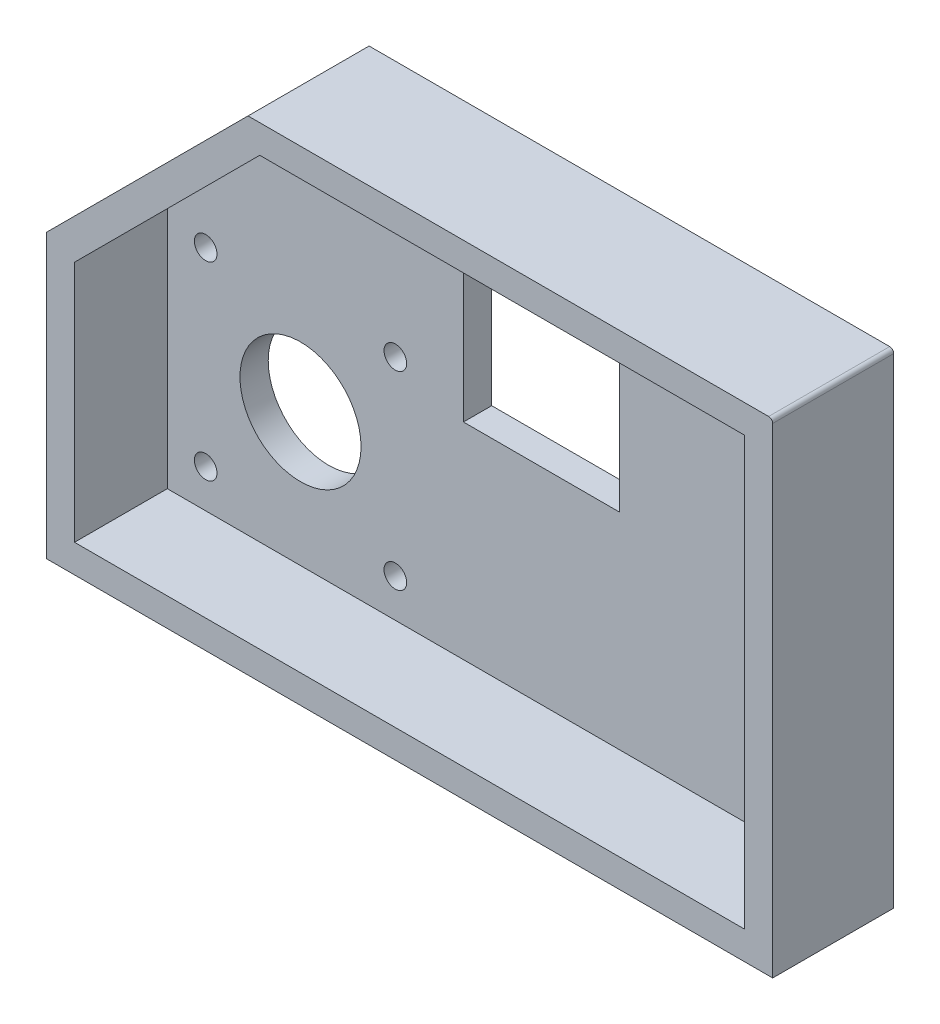
ISO-10303-21;
HEADER;
FILE_DESCRIPTION(('STEP AP214'),'2;1');
FILE_NAME('part.step','',(''),(''),'','','');
FILE_SCHEMA(('AUTOMOTIVE_DESIGN { 1 0 10303 214 1 1 1 1 }'));
ENDSEC;
DATA;
#1=APPLICATION_CONTEXT('core data for automotive mechanical design processes');
#2=APPLICATION_PROTOCOL_DEFINITION('international standard','automotive_design',2000,#1);
#3=PRODUCT_CONTEXT('',#1,'mechanical');
#4=PRODUCT('Part','Part','',(#3));
#5=PRODUCT_RELATED_PRODUCT_CATEGORY('part','',(#4));
#6=PRODUCT_DEFINITION_FORMATION('','',#4);
#7=PRODUCT_DEFINITION_CONTEXT('part definition',#1,'design');
#8=PRODUCT_DEFINITION('design','',#6,#7);
#9=PRODUCT_DEFINITION_SHAPE('','',#8);
#10=(LENGTH_UNIT() NAMED_UNIT(*) SI_UNIT(.MILLI.,.METRE.));
#11=(NAMED_UNIT(*) PLANE_ANGLE_UNIT() SI_UNIT($,.RADIAN.));
#12=(NAMED_UNIT(*) SI_UNIT($,.STERADIAN.) SOLID_ANGLE_UNIT());
#13=UNCERTAINTY_MEASURE_WITH_UNIT(LENGTH_MEASURE(1.E-05),#10,'distance_accuracy_value','');
#14=(GEOMETRIC_REPRESENTATION_CONTEXT(3) GLOBAL_UNCERTAINTY_ASSIGNED_CONTEXT((#13)) GLOBAL_UNIT_ASSIGNED_CONTEXT((#10,
#11,#12)) REPRESENTATION_CONTEXT('',''));
#15=CARTESIAN_POINT('',(0.,0.,0.));
#16=DIRECTION('',(0.,0.,1.));
#17=DIRECTION('',(1.,0.,0.));
#18=AXIS2_PLACEMENT_3D('',#15,#16,#17);
#19=CARTESIAN_POINT('',(-35.0799037167926,-32.7220936044638,-13.));
#20=DIRECTION('',(0.,0.,1.));
#21=DIRECTION('',(1.,0.,0.));
#22=AXIS2_PLACEMENT_3D('',#19,#20,#21);
#23=CYLINDRICAL_SURFACE('',#22,2.80599900368879);
#24=CARTESIAN_POINT('',(-35.0799037167926,-32.7220936044638,0.));
#25=DIRECTION('',(0.,0.,-1.));
#26=DIRECTION('',(-1.,0.,0.));
#27=AXIS2_PLACEMENT_3D('',#24,#25,#26);
#28=CIRCLE('',#27,2.80599900368879);
#29=CARTESIAN_POINT('',(-37.8859027204814,-32.7220936044638,0.));
#30=VERTEX_POINT('',#29);
#31=EDGE_CURVE('E47',#30,#30,#28,.T.);
#32=ORIENTED_EDGE('',*,*,#31,.T.);
#33=EDGE_LOOP('',(#32));
#34=FACE_BOUND('',#33,.T.);
#35=CARTESIAN_POINT('',(-35.0799037167926,-32.7220936044638,7.));
#36=DIRECTION('',(0.,0.,1.));
#37=DIRECTION('',(1.,0.,0.));
#38=AXIS2_PLACEMENT_3D('',#35,#36,#37);
#39=CIRCLE('',#38,2.80599900368879);
#40=CARTESIAN_POINT('',(-32.2739047131038,-32.7220936044638,7.));
#41=VERTEX_POINT('',#40);
#42=EDGE_CURVE('E11',#41,#41,#39,.T.);
#43=ORIENTED_EDGE('',*,*,#42,.T.);
#44=EDGE_LOOP('',(#43));
#45=FACE_BOUND('',#44,.T.);
#46=ADVANCED_FACE('F39',(#34,#45),#23,.F.);
#47=CARTESIAN_POINT('',(-82.0799037167926,-32.7220936044638,-13.));
#48=DIRECTION('',(0.,0.,1.));
#49=DIRECTION('',(1.,0.,0.));
#50=AXIS2_PLACEMENT_3D('',#47,#48,#49);
#51=CYLINDRICAL_SURFACE('',#50,2.80599900368879);
#52=CARTESIAN_POINT('',(-82.0799037167926,-32.7220936044638,0.));
#53=DIRECTION('',(0.,0.,-1.));
#54=DIRECTION('',(-1.,0.,0.));
#55=AXIS2_PLACEMENT_3D('',#52,#53,#54);
#56=CIRCLE('',#55,2.80599900368879);
#57=CARTESIAN_POINT('',(-84.8859027204814,-32.7220936044638,0.));
#58=VERTEX_POINT('',#57);
#59=EDGE_CURVE('E330',#58,#58,#56,.T.);
#60=ORIENTED_EDGE('',*,*,#59,.T.);
#61=EDGE_LOOP('',(#60));
#62=FACE_BOUND('',#61,.T.);
#63=CARTESIAN_POINT('',(-82.0799037167926,-32.7220936044638,7.));
#64=DIRECTION('',(0.,0.,1.));
#65=DIRECTION('',(1.,0.,0.));
#66=AXIS2_PLACEMENT_3D('',#63,#64,#65);
#67=CIRCLE('',#66,2.80599900368879);
#68=CARTESIAN_POINT('',(-79.2739047131038,-32.7220936044638,7.));
#69=VERTEX_POINT('',#68);
#70=EDGE_CURVE('E334',#69,#69,#67,.T.);
#71=ORIENTED_EDGE('',*,*,#70,.T.);
#72=EDGE_LOOP('',(#71));
#73=FACE_BOUND('',#72,.T.);
#74=ADVANCED_FACE('F363',(#62,#73),#51,.F.);
#75=CARTESIAN_POINT('',(80.4200962832074,69.7779063955362,30.));
#76=DIRECTION('',(0.,0.,-1.));
#77=DIRECTION('',(-1.,0.,0.));
#78=AXIS2_PLACEMENT_3D('',#75,#76,#77);
#79=PLANE('',#78);
#80=DIRECTION('',(0.,1.,0.));
#81=VECTOR('',#80,1.);
#82=CARTESIAN_POINT('',(81.4200962832074,69.7779063955362,30.));
#83=LINE('',#82,#81);
#84=CARTESIAN_POINT('',(81.4200962832074,-49.2220936044638,30.));
#85=VERTEX_POINT('',#84);
#86=CARTESIAN_POINT('',(81.4200962832074,69.7779063955362,30.));
#87=VERTEX_POINT('',#86);
#88=EDGE_CURVE('E269',#85,#87,#83,.T.);
#89=ORIENTED_EDGE('',*,*,#88,.T.);
#90=CARTESIAN_POINT('',(80.4200962832074,69.7779063955362,30.));
#91=DIRECTION('',(0.,0.,1.));
#92=DIRECTION('',(-1.,0.,0.));
#93=AXIS2_PLACEMENT_3D('',#90,#91,#92);
#94=CIRCLE('',#93,1.00000000000001);
#95=CARTESIAN_POINT('',(80.4200962832074,70.7779063955362,30.));
#96=VERTEX_POINT('',#95);
#97=EDGE_CURVE('E273',#87,#96,#94,.T.);
#98=ORIENTED_EDGE('',*,*,#97,.T.);
#99=DIRECTION('',(-1.,0.,0.));
#100=VECTOR('',#99,1.);
#101=CARTESIAN_POINT('',(-48.5799037167926,70.7779063955362,30.));
#102=LINE('',#101,#100);
#103=CARTESIAN_POINT('',(-48.5799037167926,70.7779063955362,30.));
#104=VERTEX_POINT('',#103);
#105=EDGE_CURVE('E277',#96,#104,#102,.T.);
#106=ORIENTED_EDGE('',*,*,#105,.T.);
#107=DIRECTION('',(-0.707106781186547,-0.707106781186547,0.));
#108=VECTOR('',#107,1.);
#109=CARTESIAN_POINT('',(-48.5799037167926,70.7779063955362,30.));
#110=LINE('',#109,#108);
#111=CARTESIAN_POINT('',(-98.5799037167926,20.7779063955362,30.));
#112=VERTEX_POINT('',#111);
#113=EDGE_CURVE('E280',#104,#112,#110,.T.);
#114=ORIENTED_EDGE('',*,*,#113,.T.);
#115=DIRECTION('',(0.,-1.,0.));
#116=VECTOR('',#115,1.);
#117=CARTESIAN_POINT('',(-98.5799037167926,20.7779063955362,30.));
#118=LINE('',#117,#116);
#119=CARTESIAN_POINT('',(-98.5799037167926,-49.2220936044638,30.));
#120=VERTEX_POINT('',#119);
#121=EDGE_CURVE('E283',#112,#120,#118,.T.);
#122=ORIENTED_EDGE('',*,*,#121,.T.);
#123=DIRECTION('',(1.,0.,0.));
#124=VECTOR('',#123,1.);
#125=CARTESIAN_POINT('',(-98.5799037167926,-49.2220936044638,30.));
#126=LINE('',#125,#124);
#127=EDGE_CURVE('E286',#120,#85,#126,.T.);
#128=ORIENTED_EDGE('',*,*,#127,.T.);
#129=EDGE_LOOP('',(#89,#98,#106,#114,#122,#128));
#130=FACE_BOUND('',#129,.T.);
#131=DIRECTION('',(0.,1.,0.));
#132=VECTOR('',#131,1.);
#133=CARTESIAN_POINT('',(74.4200962832074,69.7779063955362,30.));
#134=LINE('',#133,#132);
#135=CARTESIAN_POINT('',(74.4200962832074,-42.2220936044638,30.));
#136=VERTEX_POINT('',#135);
#137=CARTESIAN_POINT('',(74.4200962832074,63.7779063955362,30.));
#138=VERTEX_POINT('',#137);
#139=EDGE_CURVE('E254',#136,#138,#134,.T.);
#140=ORIENTED_EDGE('',*,*,#139,.F.);
#141=DIRECTION('',(1.,0.,0.));
#142=VECTOR('',#141,1.);
#143=CARTESIAN_POINT('',(80.4200962832074,-42.2220936044638,30.));
#144=LINE('',#143,#142);
#145=CARTESIAN_POINT('',(-91.5799037167926,-42.2220936044638,30.));
#146=VERTEX_POINT('',#145);
#147=EDGE_CURVE('E232',#146,#136,#144,.T.);
#148=ORIENTED_EDGE('',*,*,#147,.F.);
#149=DIRECTION('',(0.,-1.,0.));
#150=VECTOR('',#149,1.);
#151=CARTESIAN_POINT('',(-91.5799037167926,69.7779063955362,30.));
#152=LINE('',#151,#150);
#153=CARTESIAN_POINT('',(-91.5799037167926,17.8784114589246,30.));
#154=VERTEX_POINT('',#153);
#155=EDGE_CURVE('E263',#154,#146,#152,.T.);
#156=ORIENTED_EDGE('',*,*,#155,.F.);
#157=DIRECTION('',(-0.707106781186548,-0.707106781186548,0.));
#158=VECTOR('',#157,1.);
#159=CARTESIAN_POINT('',(20.3698437515132,129.82815892723,30.));
#160=LINE('',#159,#158);
#161=CARTESIAN_POINT('',(-45.680408780181,63.7779063955362,30.));
#162=VERTEX_POINT('',#161);
#163=EDGE_CURVE('E260',#162,#154,#160,.T.);
#164=ORIENTED_EDGE('',*,*,#163,.F.);
#165=DIRECTION('',(-1.,0.,0.));
#166=VECTOR('',#165,1.);
#167=CARTESIAN_POINT('',(80.4200962832074,63.7779063955362,30.));
#168=LINE('',#167,#166);
#169=EDGE_CURVE('E257',#138,#162,#168,.T.);
#170=ORIENTED_EDGE('',*,*,#169,.F.);
#171=EDGE_LOOP('',(#140,#148,#156,#164,#170));
#172=FACE_BOUND('',#171,.T.);
#173=ADVANCED_FACE('F367',(#130,#172),#79,.F.);
#174=CARTESIAN_POINT('',(81.4200962832074,69.7779063955362,30.));
#175=DIRECTION('',(-1.,0.,0.));
#176=DIRECTION('',(0.,-1.,0.));
#177=AXIS2_PLACEMENT_3D('',#174,#175,#176);
#178=PLANE('',#177);
#179=DIRECTION('',(0.,1.,0.));
#180=VECTOR('',#179,1.);
#181=CARTESIAN_POINT('',(81.4200962832074,69.7779063955362,0.));
#182=LINE('',#181,#180);
#183=CARTESIAN_POINT('',(81.4200962832074,-49.2220936044638,0.));
#184=VERTEX_POINT('',#183);
#185=CARTESIAN_POINT('',(81.4200962832074,69.7779063955362,0.));
#186=VERTEX_POINT('',#185);
#187=EDGE_CURVE('E225',#184,#186,#182,.T.);
#188=ORIENTED_EDGE('',*,*,#187,.T.);
#189=DIRECTION('',(0.,0.,-1.));
#190=VECTOR('',#189,1.);
#191=CARTESIAN_POINT('',(81.4200962832074,69.7779063955362,30.));
#192=LINE('',#191,#190);
#193=EDGE_CURVE('E326',#87,#186,#192,.T.);
#194=ORIENTED_EDGE('',*,*,#193,.F.);
#195=ORIENTED_EDGE('',*,*,#88,.F.);
#196=DIRECTION('',(0.,0.,-1.));
#197=VECTOR('',#196,1.);
#198=CARTESIAN_POINT('',(81.4200962832074,-49.2220936044638,30.));
#199=LINE('',#198,#197);
#200=EDGE_CURVE('E289',#85,#184,#199,.T.);
#201=ORIENTED_EDGE('',*,*,#200,.T.);
#202=EDGE_LOOP('',(#188,#194,#195,#201));
#203=FACE_BOUND('',#202,.T.);
#204=ADVANCED_FACE('F372',(#203),#178,.F.);
#205=CARTESIAN_POINT('',(80.4200962832074,69.7779063955362,30.));
#206=DIRECTION('',(0.,0.,-1.));
#207=DIRECTION('',(-1.,0.,0.));
#208=AXIS2_PLACEMENT_3D('',#205,#206,#207);
#209=CYLINDRICAL_SURFACE('',#208,1.00000000000001);
#210=CARTESIAN_POINT('',(80.4200962832074,69.7779063955362,0.));
#211=DIRECTION('',(0.,0.,1.));
#212=DIRECTION('',(-1.,0.,0.));
#213=AXIS2_PLACEMENT_3D('',#210,#211,#212);
#214=CIRCLE('',#213,1.00000000000001);
#215=CARTESIAN_POINT('',(80.4200962832074,70.7779063955362,0.));
#216=VERTEX_POINT('',#215);
#217=EDGE_CURVE('E293',#186,#216,#214,.T.);
#218=ORIENTED_EDGE('',*,*,#217,.T.);
#219=DIRECTION('',(0.,0.,-1.));
#220=VECTOR('',#219,1.);
#221=CARTESIAN_POINT('',(80.4200962832074,70.7779063955362,30.));
#222=LINE('',#221,#220);
#223=EDGE_CURVE('E322',#96,#216,#222,.T.);
#224=ORIENTED_EDGE('',*,*,#223,.F.);
#225=ORIENTED_EDGE('',*,*,#97,.F.);
#226=ORIENTED_EDGE('',*,*,#193,.T.);
#227=EDGE_LOOP('',(#218,#224,#225,#226));
#228=FACE_BOUND('',#227,.T.);
#229=ADVANCED_FACE('F378',(#228),#209,.T.);
#230=CARTESIAN_POINT('',(-48.5799037167926,70.7779063955362,30.));
#231=DIRECTION('',(0.,-1.,0.));
#232=DIRECTION('',(1.,0.,0.));
#233=AXIS2_PLACEMENT_3D('',#230,#231,#232);
#234=PLANE('',#233);
#235=DIRECTION('',(-1.,0.,0.));
#236=VECTOR('',#235,1.);
#237=CARTESIAN_POINT('',(-48.5799037167926,70.7779063955362,0.));
#238=LINE('',#237,#236);
#239=CARTESIAN_POINT('',(-48.5799037167926,70.7779063955362,0.));
#240=VERTEX_POINT('',#239);
#241=EDGE_CURVE('E296',#216,#240,#238,.T.);
#242=ORIENTED_EDGE('',*,*,#241,.T.);
#243=DIRECTION('',(0.,0.,-1.));
#244=VECTOR('',#243,1.);
#245=CARTESIAN_POINT('',(-48.5799037167926,70.7779063955362,30.));
#246=LINE('',#245,#244);
#247=EDGE_CURVE('E318',#104,#240,#246,.T.);
#248=ORIENTED_EDGE('',*,*,#247,.F.);
#249=ORIENTED_EDGE('',*,*,#105,.F.);
#250=ORIENTED_EDGE('',*,*,#223,.T.);
#251=EDGE_LOOP('',(#242,#248,#249,#250));
#252=FACE_BOUND('',#251,.T.);
#253=ADVANCED_FACE('F382',(#252),#234,.F.);
#254=CARTESIAN_POINT('',(-48.5799037167926,70.7779063955362,30.));
#255=DIRECTION('',(0.707106781186547,-0.707106781186547,0.));
#256=DIRECTION('',(0.707106781186548,0.707106781186548,0.));
#257=AXIS2_PLACEMENT_3D('',#254,#255,#256);
#258=PLANE('',#257);
#259=DIRECTION('',(-0.707106781186547,-0.707106781186547,0.));
#260=VECTOR('',#259,1.);
#261=CARTESIAN_POINT('',(-48.5799037167926,70.7779063955362,0.));
#262=LINE('',#261,#260);
#263=CARTESIAN_POINT('',(-98.5799037167926,20.7779063955362,0.));
#264=VERTEX_POINT('',#263);
#265=EDGE_CURVE('E299',#240,#264,#262,.T.);
#266=ORIENTED_EDGE('',*,*,#265,.T.);
#267=DIRECTION('',(0.,0.,-1.));
#268=VECTOR('',#267,1.);
#269=CARTESIAN_POINT('',(-98.5799037167926,20.7779063955362,30.));
#270=LINE('',#269,#268);
#271=EDGE_CURVE('E314',#112,#264,#270,.T.);
#272=ORIENTED_EDGE('',*,*,#271,.F.);
#273=ORIENTED_EDGE('',*,*,#113,.F.);
#274=ORIENTED_EDGE('',*,*,#247,.T.);
#275=EDGE_LOOP('',(#266,#272,#273,#274));
#276=FACE_BOUND('',#275,.T.);
#277=ADVANCED_FACE('F386',(#276),#258,.F.);
#278=CARTESIAN_POINT('',(-98.5799037167926,20.7779063955362,30.));
#279=DIRECTION('',(1.,0.,0.));
#280=DIRECTION('',(0.,0.,-1.));
#281=AXIS2_PLACEMENT_3D('',#278,#279,#280);
#282=PLANE('',#281);
#283=DIRECTION('',(0.,-1.,0.));
#284=VECTOR('',#283,1.);
#285=CARTESIAN_POINT('',(-98.5799037167926,20.7779063955362,0.));
#286=LINE('',#285,#284);
#287=CARTESIAN_POINT('',(-98.5799037167926,-49.2220936044638,0.));
#288=VERTEX_POINT('',#287);
#289=EDGE_CURVE('E302',#264,#288,#286,.T.);
#290=ORIENTED_EDGE('',*,*,#289,.T.);
#291=DIRECTION('',(0.,0.,-1.));
#292=VECTOR('',#291,1.);
#293=CARTESIAN_POINT('',(-98.5799037167926,-49.2220936044638,30.));
#294=LINE('',#293,#292);
#295=EDGE_CURVE('E310',#120,#288,#294,.T.);
#296=ORIENTED_EDGE('',*,*,#295,.F.);
#297=ORIENTED_EDGE('',*,*,#121,.F.);
#298=ORIENTED_EDGE('',*,*,#271,.T.);
#299=EDGE_LOOP('',(#290,#296,#297,#298));
#300=FACE_BOUND('',#299,.T.);
#301=ADVANCED_FACE('F356',(#300),#282,.F.);
#302=CARTESIAN_POINT('',(-98.5799037167926,-49.2220936044638,30.));
#303=DIRECTION('',(0.,1.,0.));
#304=DIRECTION('',(0.,0.,1.));
#305=AXIS2_PLACEMENT_3D('',#302,#303,#304);
#306=PLANE('',#305);
#307=DIRECTION('',(1.,0.,0.));
#308=VECTOR('',#307,1.);
#309=CARTESIAN_POINT('',(-98.5799037167926,-49.2220936044638,0.));
#310=LINE('',#309,#308);
#311=EDGE_CURVE('E274',#288,#184,#310,.T.);
#312=ORIENTED_EDGE('',*,*,#311,.T.);
#313=ORIENTED_EDGE('',*,*,#200,.F.);
#314=ORIENTED_EDGE('',*,*,#127,.F.);
#315=ORIENTED_EDGE('',*,*,#295,.T.);
#316=EDGE_LOOP('',(#312,#313,#314,#315));
#317=FACE_BOUND('',#316,.T.);
#318=ADVANCED_FACE('F346',(#317),#306,.F.);
#319=CARTESIAN_POINT('',(80.4200962832074,69.7779063955362,0.));
#320=DIRECTION('',(0.,0.,-1.));
#321=DIRECTION('',(-1.,0.,0.));
#322=AXIS2_PLACEMENT_3D('',#319,#320,#321);
#323=PLANE('',#322);
#324=DIRECTION('',(0.,1.,0.));
#325=VECTOR('',#324,1.);
#326=CARTESIAN_POINT('',(-18.2033791769043,69.7779063955362,0.));
#327=LINE('',#326,#325);
#328=CARTESIAN_POINT('',(-18.2033791769043,8.77938532975274,0.));
#329=VERTEX_POINT('',#328);
#330=CARTESIAN_POINT('',(-18.2033791769043,47.1447612410815,0.));
#331=VERTEX_POINT('',#330);
#332=EDGE_CURVE('E189',#329,#331,#327,.T.);
#333=ORIENTED_EDGE('',*,*,#332,.F.);
#334=DIRECTION('',(-1.,0.,0.));
#335=VECTOR('',#334,1.);
#336=CARTESIAN_POINT('',(80.4200962832074,8.77938532975274,0.));
#337=LINE('',#336,#335);
#338=CARTESIAN_POINT('',(20.4194824787958,8.77938532975274,0.));
#339=VERTEX_POINT('',#338);
#340=EDGE_CURVE('E177',#339,#329,#337,.T.);
#341=ORIENTED_EDGE('',*,*,#340,.F.);
#342=DIRECTION('',(0.,-1.,0.));
#343=VECTOR('',#342,1.);
#344=CARTESIAN_POINT('',(20.4194824787958,69.7779063955362,0.));
#345=LINE('',#344,#343);
#346=CARTESIAN_POINT('',(20.4194824787958,47.1447612410815,0.));
#347=VERTEX_POINT('',#346);
#348=EDGE_CURVE('E152',#347,#339,#345,.T.);
#349=ORIENTED_EDGE('',*,*,#348,.F.);
#350=DIRECTION('',(1.,0.,0.));
#351=VECTOR('',#350,1.);
#352=CARTESIAN_POINT('',(80.4200962832074,47.1447612410815,0.));
#353=LINE('',#352,#351);
#354=EDGE_CURVE('E186',#331,#347,#353,.T.);
#355=ORIENTED_EDGE('',*,*,#354,.F.);
#356=EDGE_LOOP('',(#333,#341,#349,#355));
#357=FACE_BOUND('',#356,.T.);
#358=CARTESIAN_POINT('',(-35.0799037167926,14.2779063955362,0.));
#359=DIRECTION('',(0.,0.,-1.));
#360=DIRECTION('',(-1.,0.,0.));
#361=AXIS2_PLACEMENT_3D('',#358,#359,#360);
#362=CIRCLE('',#361,2.80599900368879);
#363=CARTESIAN_POINT('',(-37.8859027204814,14.2779063955362,0.));
#364=VERTEX_POINT('',#363);
#365=EDGE_CURVE('E192',#364,#364,#362,.T.);
#366=ORIENTED_EDGE('',*,*,#365,.F.);
#367=EDGE_LOOP('',(#366));
#368=FACE_BOUND('',#367,.T.);
#369=CARTESIAN_POINT('',(-82.0799037167926,14.2779063955362,0.));
#370=DIRECTION('',(0.,0.,-1.));
#371=DIRECTION('',(-1.,0.,0.));
#372=AXIS2_PLACEMENT_3D('',#369,#370,#371);
#373=CIRCLE('',#372,2.80599900368879);
#374=CARTESIAN_POINT('',(-84.8859027204814,14.2779063955362,0.));
#375=VERTEX_POINT('',#374);
#376=EDGE_CURVE('E204',#375,#375,#373,.T.);
#377=ORIENTED_EDGE('',*,*,#376,.F.);
#378=EDGE_LOOP('',(#377));
#379=FACE_BOUND('',#378,.T.);
#380=CARTESIAN_POINT('',(-58.5799037167926,-9.22209360446376,0.));
#381=DIRECTION('',(0.,0.,-1.));
#382=DIRECTION('',(-1.,0.,0.));
#383=AXIS2_PLACEMENT_3D('',#380,#381,#382);
#384=CIRCLE('',#383,15.);
#385=CARTESIAN_POINT('',(-73.5799037167926,-9.22209360446376,0.));
#386=VERTEX_POINT('',#385);
#387=EDGE_CURVE('E212',#386,#386,#384,.T.);
#388=ORIENTED_EDGE('',*,*,#387,.F.);
#389=EDGE_LOOP('',(#388));
#390=FACE_BOUND('',#389,.T.);
#391=ORIENTED_EDGE('',*,*,#187,.F.);
#392=ORIENTED_EDGE('',*,*,#311,.F.);
#393=ORIENTED_EDGE('',*,*,#289,.F.);
#394=ORIENTED_EDGE('',*,*,#265,.F.);
#395=ORIENTED_EDGE('',*,*,#241,.F.);
#396=ORIENTED_EDGE('',*,*,#217,.F.);
#397=EDGE_LOOP('',(#391,#392,#393,#394,#395,#396));
#398=FACE_BOUND('',#397,.T.);
#399=ORIENTED_EDGE('',*,*,#59,.F.);
#400=EDGE_LOOP('',(#399));
#401=FACE_BOUND('',#400,.T.);
#402=ORIENTED_EDGE('',*,*,#31,.F.);
#403=EDGE_LOOP('',(#402));
#404=FACE_BOUND('',#403,.T.);
#405=ADVANCED_FACE('F343',(#357,#368,#379,#390,#398,#401,#404),#323,.T.);
#406=CARTESIAN_POINT('',(74.4200962832074,69.7779063955362,30.));
#407=DIRECTION('',(-1.,0.,0.));
#408=DIRECTION('',(0.,-1.,0.));
#409=AXIS2_PLACEMENT_3D('',#406,#407,#408);
#410=PLANE('',#409);
#411=DIRECTION('',(0.,1.,0.));
#412=VECTOR('',#411,1.);
#413=CARTESIAN_POINT('',(74.4200962832074,69.7779063955362,7.));
#414=LINE('',#413,#412);
#415=CARTESIAN_POINT('',(74.4200962832074,-42.2220936044638,7.));
#416=VERTEX_POINT('',#415);
#417=CARTESIAN_POINT('',(74.4200962832074,63.7779063955362,7.));
#418=VERTEX_POINT('',#417);
#419=EDGE_CURVE('E216',#416,#418,#414,.T.);
#420=ORIENTED_EDGE('',*,*,#419,.F.);
#421=DIRECTION('',(0.,0.,-1.));
#422=VECTOR('',#421,1.);
#423=CARTESIAN_POINT('',(74.4200962832074,-42.2220936044638,30.));
#424=LINE('',#423,#422);
#425=EDGE_CURVE('E227',#136,#416,#424,.T.);
#426=ORIENTED_EDGE('',*,*,#425,.F.);
#427=ORIENTED_EDGE('',*,*,#139,.T.);
#428=DIRECTION('',(0.,0.,-1.));
#429=VECTOR('',#428,1.);
#430=CARTESIAN_POINT('',(74.4200962832074,63.7779063955362,30.));
#431=LINE('',#430,#429);
#432=EDGE_CURVE('E221',#138,#418,#431,.T.);
#433=ORIENTED_EDGE('',*,*,#432,.T.);
#434=EDGE_LOOP('',(#420,#426,#427,#433));
#435=FACE_BOUND('',#434,.T.);
#436=ADVANCED_FACE('F345',(#435),#410,.T.);
#437=CARTESIAN_POINT('',(-48.5799037167926,63.7779063955362,30.));
#438=DIRECTION('',(0.,-1.,0.));
#439=DIRECTION('',(1.,0.,0.));
#440=AXIS2_PLACEMENT_3D('',#437,#438,#439);
#441=PLANE('',#440);
#442=DIRECTION('',(-1.,0.,0.));
#443=VECTOR('',#442,1.);
#444=CARTESIAN_POINT('',(80.4200962832074,63.7779063955362,7.));
#445=LINE('',#444,#443);
#446=CARTESIAN_POINT('',(-45.680408780181,63.7779063955362,7.));
#447=VERTEX_POINT('',#446);
#448=EDGE_CURVE('E220',#418,#447,#445,.T.);
#449=ORIENTED_EDGE('',*,*,#448,.F.);
#450=ORIENTED_EDGE('',*,*,#432,.F.);
#451=ORIENTED_EDGE('',*,*,#169,.T.);
#452=DIRECTION('',(0.,0.,-1.));
#453=VECTOR('',#452,1.);
#454=CARTESIAN_POINT('',(-45.680408780181,63.7779063955362,30.));
#455=LINE('',#454,#453);
#456=EDGE_CURVE('E226',#162,#447,#455,.T.);
#457=ORIENTED_EDGE('',*,*,#456,.T.);
#458=EDGE_LOOP('',(#449,#450,#451,#457));
#459=FACE_BOUND('',#458,.T.);
#460=ADVANCED_FACE('F353',(#459),#441,.T.);
#461=CARTESIAN_POINT('',(-43.6301562484868,65.8281589272304,30.));
#462=DIRECTION('',(0.707106781186547,-0.707106781186547,0.));
#463=DIRECTION('',(0.707106781186548,0.707106781186548,0.));
#464=AXIS2_PLACEMENT_3D('',#461,#462,#463);
#465=PLANE('',#464);
#466=DIRECTION('',(-0.707106781186548,-0.707106781186548,0.));
#467=VECTOR('',#466,1.);
#468=CARTESIAN_POINT('',(20.3698437515132,129.82815892723,7.));
#469=LINE('',#468,#467);
#470=CARTESIAN_POINT('',(-91.5799037167926,17.8784114589246,7.));
#471=VERTEX_POINT('',#470);
#472=EDGE_CURVE('E235',#447,#471,#469,.T.);
#473=ORIENTED_EDGE('',*,*,#472,.F.);
#474=ORIENTED_EDGE('',*,*,#456,.F.);
#475=ORIENTED_EDGE('',*,*,#163,.T.);
#476=DIRECTION('',(0.,0.,-1.));
#477=VECTOR('',#476,1.);
#478=CARTESIAN_POINT('',(-91.5799037167926,17.8784114589246,30.));
#479=LINE('',#478,#477);
#480=EDGE_CURVE('E239',#154,#471,#479,.T.);
#481=ORIENTED_EDGE('',*,*,#480,.T.);
#482=EDGE_LOOP('',(#473,#474,#475,#481));
#483=FACE_BOUND('',#482,.T.);
#484=ADVANCED_FACE('F435',(#483),#465,.T.);
#485=CARTESIAN_POINT('',(-91.5799037167926,20.7779063955362,30.));
#486=DIRECTION('',(1.,0.,0.));
#487=DIRECTION('',(0.,0.,-1.));
#488=AXIS2_PLACEMENT_3D('',#485,#486,#487);
#489=PLANE('',#488);
#490=DIRECTION('',(0.,-1.,0.));
#491=VECTOR('',#490,1.);
#492=CARTESIAN_POINT('',(-91.5799037167926,69.7779063955362,7.));
#493=LINE('',#492,#491);
#494=CARTESIAN_POINT('',(-91.5799037167926,-42.2220936044638,7.));
#495=VERTEX_POINT('',#494);
#496=EDGE_CURVE('E242',#471,#495,#493,.T.);
#497=ORIENTED_EDGE('',*,*,#496,.F.);
#498=ORIENTED_EDGE('',*,*,#480,.F.);
#499=ORIENTED_EDGE('',*,*,#155,.T.);
#500=DIRECTION('',(0.,0.,-1.));
#501=VECTOR('',#500,1.);
#502=CARTESIAN_POINT('',(-91.5799037167926,-42.2220936044638,30.));
#503=LINE('',#502,#501);
#504=EDGE_CURVE('E231',#146,#495,#503,.T.);
#505=ORIENTED_EDGE('',*,*,#504,.T.);
#506=EDGE_LOOP('',(#497,#498,#499,#505));
#507=FACE_BOUND('',#506,.T.);
#508=ADVANCED_FACE('F433',(#507),#489,.T.);
#509=CARTESIAN_POINT('',(-98.5799037167926,-42.2220936044638,30.));
#510=DIRECTION('',(0.,1.,0.));
#511=DIRECTION('',(0.,0.,1.));
#512=AXIS2_PLACEMENT_3D('',#509,#510,#511);
#513=PLANE('',#512);
#514=DIRECTION('',(1.,0.,0.));
#515=VECTOR('',#514,1.);
#516=CARTESIAN_POINT('',(80.4200962832074,-42.2220936044638,7.));
#517=LINE('',#516,#515);
#518=EDGE_CURVE('E248',#495,#416,#517,.T.);
#519=ORIENTED_EDGE('',*,*,#518,.F.);
#520=ORIENTED_EDGE('',*,*,#504,.F.);
#521=ORIENTED_EDGE('',*,*,#147,.T.);
#522=ORIENTED_EDGE('',*,*,#425,.T.);
#523=EDGE_LOOP('',(#519,#520,#521,#522));
#524=FACE_BOUND('',#523,.T.);
#525=ADVANCED_FACE('F430',(#524),#513,.T.);
#526=CARTESIAN_POINT('',(80.4200962832074,69.7779063955362,7.));
#527=DIRECTION('',(0.,0.,-1.));
#528=DIRECTION('',(-1.,0.,0.));
#529=AXIS2_PLACEMENT_3D('',#526,#527,#528);
#530=PLANE('',#529);
#531=DIRECTION('',(1.,0.,0.));
#532=VECTOR('',#531,1.);
#533=CARTESIAN_POINT('',(-18.2033791769043,8.77938532975274,7.));
#534=LINE('',#533,#532);
#535=CARTESIAN_POINT('',(-18.2033791769043,8.77938532975274,7.));
#536=VERTEX_POINT('',#535);
#537=CARTESIAN_POINT('',(20.4194824787958,8.77938532975274,7.));
#538=VERTEX_POINT('',#537);
#539=EDGE_CURVE('E159',#536,#538,#534,.T.);
#540=ORIENTED_EDGE('',*,*,#539,.F.);
#541=DIRECTION('',(0.,-1.,0.));
#542=VECTOR('',#541,1.);
#543=CARTESIAN_POINT('',(-18.2033791769043,47.1447612410815,7.));
#544=LINE('',#543,#542);
#545=CARTESIAN_POINT('',(-18.2033791769043,47.1447612410815,7.));
#546=VERTEX_POINT('',#545);
#547=EDGE_CURVE('E62',#546,#536,#544,.T.);
#548=ORIENTED_EDGE('',*,*,#547,.F.);
#549=DIRECTION('',(-1.,0.,0.));
#550=VECTOR('',#549,1.);
#551=CARTESIAN_POINT('',(-18.2033791769043,47.1447612410815,7.));
#552=LINE('',#551,#550);
#553=CARTESIAN_POINT('',(20.4194824787958,47.1447612410815,7.));
#554=VERTEX_POINT('',#553);
#555=EDGE_CURVE('E167',#554,#546,#552,.T.);
#556=ORIENTED_EDGE('',*,*,#555,.F.);
#557=DIRECTION('',(0.,1.,0.));
#558=VECTOR('',#557,1.);
#559=CARTESIAN_POINT('',(20.4194824787958,47.1447612410815,7.));
#560=LINE('',#559,#558);
#561=EDGE_CURVE('E149',#538,#554,#560,.T.);
#562=ORIENTED_EDGE('',*,*,#561,.F.);
#563=EDGE_LOOP('',(#540,#548,#556,#562));
#564=FACE_BOUND('',#563,.T.);
#565=CARTESIAN_POINT('',(-35.0799037167926,14.2779063955362,7.));
#566=DIRECTION('',(0.,0.,1.));
#567=DIRECTION('',(1.,0.,0.));
#568=AXIS2_PLACEMENT_3D('',#565,#566,#567);
#569=CIRCLE('',#568,2.80599900368879);
#570=CARTESIAN_POINT('',(-32.2739047131038,14.2779063955362,7.));
#571=VERTEX_POINT('',#570);
#572=EDGE_CURVE('E196',#571,#571,#569,.T.);
#573=ORIENTED_EDGE('',*,*,#572,.F.);
#574=EDGE_LOOP('',(#573));
#575=FACE_BOUND('',#574,.T.);
#576=CARTESIAN_POINT('',(-82.0799037167926,14.2779063955362,7.));
#577=DIRECTION('',(0.,0.,1.));
#578=DIRECTION('',(1.,0.,0.));
#579=AXIS2_PLACEMENT_3D('',#576,#577,#578);
#580=CIRCLE('',#579,2.80599900368879);
#581=CARTESIAN_POINT('',(-79.2739047131038,14.2779063955362,7.));
#582=VERTEX_POINT('',#581);
#583=EDGE_CURVE('E200',#582,#582,#580,.T.);
#584=ORIENTED_EDGE('',*,*,#583,.F.);
#585=EDGE_LOOP('',(#584));
#586=FACE_BOUND('',#585,.T.);
#587=CARTESIAN_POINT('',(-58.5799037167926,-9.22209360446376,7.));
#588=DIRECTION('',(0.,0.,1.));
#589=DIRECTION('',(1.,0.,0.));
#590=AXIS2_PLACEMENT_3D('',#587,#588,#589);
#591=CIRCLE('',#590,15.);
#592=CARTESIAN_POINT('',(-43.5799037167926,-9.22209360446376,7.));
#593=VERTEX_POINT('',#592);
#594=EDGE_CURVE('E208',#593,#593,#591,.T.);
#595=ORIENTED_EDGE('',*,*,#594,.F.);
#596=EDGE_LOOP('',(#595));
#597=FACE_BOUND('',#596,.T.);
#598=ORIENTED_EDGE('',*,*,#419,.T.);
#599=ORIENTED_EDGE('',*,*,#448,.T.);
#600=ORIENTED_EDGE('',*,*,#472,.T.);
#601=ORIENTED_EDGE('',*,*,#496,.T.);
#602=ORIENTED_EDGE('',*,*,#518,.T.);
#603=EDGE_LOOP('',(#598,#599,#600,#601,#602));
#604=FACE_BOUND('',#603,.T.);
#605=ORIENTED_EDGE('',*,*,#70,.F.);
#606=EDGE_LOOP('',(#605));
#607=FACE_BOUND('',#606,.T.);
#608=ORIENTED_EDGE('',*,*,#42,.F.);
#609=EDGE_LOOP('',(#608));
#610=FACE_BOUND('',#609,.T.);
#611=ADVANCED_FACE('F164',(#564,#575,#586,#597,#604,#607,#610),#530,.F.);
#612=CARTESIAN_POINT('',(-58.5799037167926,-9.22209360446376,-13.));
#613=DIRECTION('',(0.,0.,1.));
#614=DIRECTION('',(1.,0.,0.));
#615=AXIS2_PLACEMENT_3D('',#612,#613,#614);
#616=CYLINDRICAL_SURFACE('',#615,15.);
#617=ORIENTED_EDGE('',*,*,#387,.T.);
#618=EDGE_LOOP('',(#617));
#619=FACE_BOUND('',#618,.T.);
#620=ORIENTED_EDGE('',*,*,#594,.T.);
#621=EDGE_LOOP('',(#620));
#622=FACE_BOUND('',#621,.T.);
#623=ADVANCED_FACE('F448',(#619,#622),#616,.F.);
#624=CARTESIAN_POINT('',(-82.0799037167926,14.2779063955362,-13.));
#625=DIRECTION('',(0.,0.,1.));
#626=DIRECTION('',(1.,0.,0.));
#627=AXIS2_PLACEMENT_3D('',#624,#625,#626);
#628=CYLINDRICAL_SURFACE('',#627,2.80599900368879);
#629=ORIENTED_EDGE('',*,*,#376,.T.);
#630=EDGE_LOOP('',(#629));
#631=FACE_BOUND('',#630,.T.);
#632=ORIENTED_EDGE('',*,*,#583,.T.);
#633=EDGE_LOOP('',(#632));
#634=FACE_BOUND('',#633,.T.);
#635=ADVANCED_FACE('F452',(#631,#634),#628,.F.);
#636=CARTESIAN_POINT('',(-35.0799037167926,14.2779063955362,-13.));
#637=DIRECTION('',(0.,0.,1.));
#638=DIRECTION('',(1.,0.,0.));
#639=AXIS2_PLACEMENT_3D('',#636,#637,#638);
#640=CYLINDRICAL_SURFACE('',#639,2.80599900368879);
#641=ORIENTED_EDGE('',*,*,#365,.T.);
#642=EDGE_LOOP('',(#641));
#643=FACE_BOUND('',#642,.T.);
#644=ORIENTED_EDGE('',*,*,#572,.T.);
#645=EDGE_LOOP('',(#644));
#646=FACE_BOUND('',#645,.T.);
#647=ADVANCED_FACE('F458',(#643,#646),#640,.F.);
#648=CARTESIAN_POINT('',(-18.2033791769043,47.1447612410815,-13.));
#649=DIRECTION('',(-1.,0.,0.));
#650=DIRECTION('',(0.,0.,1.));
#651=AXIS2_PLACEMENT_3D('',#648,#649,#650);
#652=PLANE('',#651);
#653=ORIENTED_EDGE('',*,*,#332,.T.);
#654=DIRECTION('',(0.,0.,1.));
#655=VECTOR('',#654,1.);
#656=CARTESIAN_POINT('',(-18.2033791769043,47.1447612410815,-13.));
#657=LINE('',#656,#655);
#658=EDGE_CURVE('E174',#331,#546,#657,.T.);
#659=ORIENTED_EDGE('',*,*,#658,.T.);
#660=ORIENTED_EDGE('',*,*,#547,.T.);
#661=DIRECTION('',(0.,0.,1.));
#662=VECTOR('',#661,1.);
#663=CARTESIAN_POINT('',(-18.2033791769043,8.77938532975274,-13.));
#664=LINE('',#663,#662);
#665=EDGE_CURVE('E156',#329,#536,#664,.T.);
#666=ORIENTED_EDGE('',*,*,#665,.F.);
#667=EDGE_LOOP('',(#653,#659,#660,#666));
#668=FACE_BOUND('',#667,.T.);
#669=ADVANCED_FACE('F465',(#668),#652,.F.);
#670=CARTESIAN_POINT('',(-18.2033791769043,47.1447612410815,-13.));
#671=DIRECTION('',(0.,1.,0.));
#672=DIRECTION('',(0.,0.,1.));
#673=AXIS2_PLACEMENT_3D('',#670,#671,#672);
#674=PLANE('',#673);
#675=ORIENTED_EDGE('',*,*,#354,.T.);
#676=DIRECTION('',(0.,0.,1.));
#677=VECTOR('',#676,1.);
#678=CARTESIAN_POINT('',(20.4194824787958,47.1447612410815,-13.));
#679=LINE('',#678,#677);
#680=EDGE_CURVE('E155',#347,#554,#679,.T.);
#681=ORIENTED_EDGE('',*,*,#680,.T.);
#682=ORIENTED_EDGE('',*,*,#555,.T.);
#683=ORIENTED_EDGE('',*,*,#658,.F.);
#684=EDGE_LOOP('',(#675,#681,#682,#683));
#685=FACE_BOUND('',#684,.T.);
#686=ADVANCED_FACE('F469',(#685),#674,.F.);
#687=CARTESIAN_POINT('',(20.4194824787958,47.1447612410815,-13.));
#688=DIRECTION('',(1.,0.,0.));
#689=DIRECTION('',(0.,0.,-1.));
#690=AXIS2_PLACEMENT_3D('',#687,#688,#689);
#691=PLANE('',#690);
#692=ORIENTED_EDGE('',*,*,#348,.T.);
#693=DIRECTION('',(0.,0.,1.));
#694=VECTOR('',#693,1.);
#695=CARTESIAN_POINT('',(20.4194824787958,8.77938532975274,-13.));
#696=LINE('',#695,#694);
#697=EDGE_CURVE('E54',#339,#538,#696,.T.);
#698=ORIENTED_EDGE('',*,*,#697,.T.);
#699=ORIENTED_EDGE('',*,*,#561,.T.);
#700=ORIENTED_EDGE('',*,*,#680,.F.);
#701=EDGE_LOOP('',(#692,#698,#699,#700));
#702=FACE_BOUND('',#701,.T.);
#703=ADVANCED_FACE('F146',(#702),#691,.F.);
#704=CARTESIAN_POINT('',(-18.2033791769043,8.77938532975274,-13.));
#705=DIRECTION('',(0.,-1.,0.));
#706=DIRECTION('',(0.,0.,-1.));
#707=AXIS2_PLACEMENT_3D('',#704,#705,#706);
#708=PLANE('',#707);
#709=ORIENTED_EDGE('',*,*,#340,.T.);
#710=ORIENTED_EDGE('',*,*,#665,.T.);
#711=ORIENTED_EDGE('',*,*,#539,.T.);
#712=ORIENTED_EDGE('',*,*,#697,.F.);
#713=EDGE_LOOP('',(#709,#710,#711,#712));
#714=FACE_BOUND('',#713,.T.);
#715=ADVANCED_FACE('F160',(#714),#708,.F.);
#716=CLOSED_SHELL('',(#46,#74,#173,#204,#229,#253,#277,#301,#318,#405,#436,#460,#484,#508,#525,
#611,#623,#635,#647,#669,#686,#703,#715));
#717=MANIFOLD_SOLID_BREP('B2',#716);
#718=ADVANCED_BREP_SHAPE_REPRESENTATION('',(#18,#717),#14);
#719=SHAPE_DEFINITION_REPRESENTATION(#9,#718);
ENDSEC;
END-ISO-10303-21;
